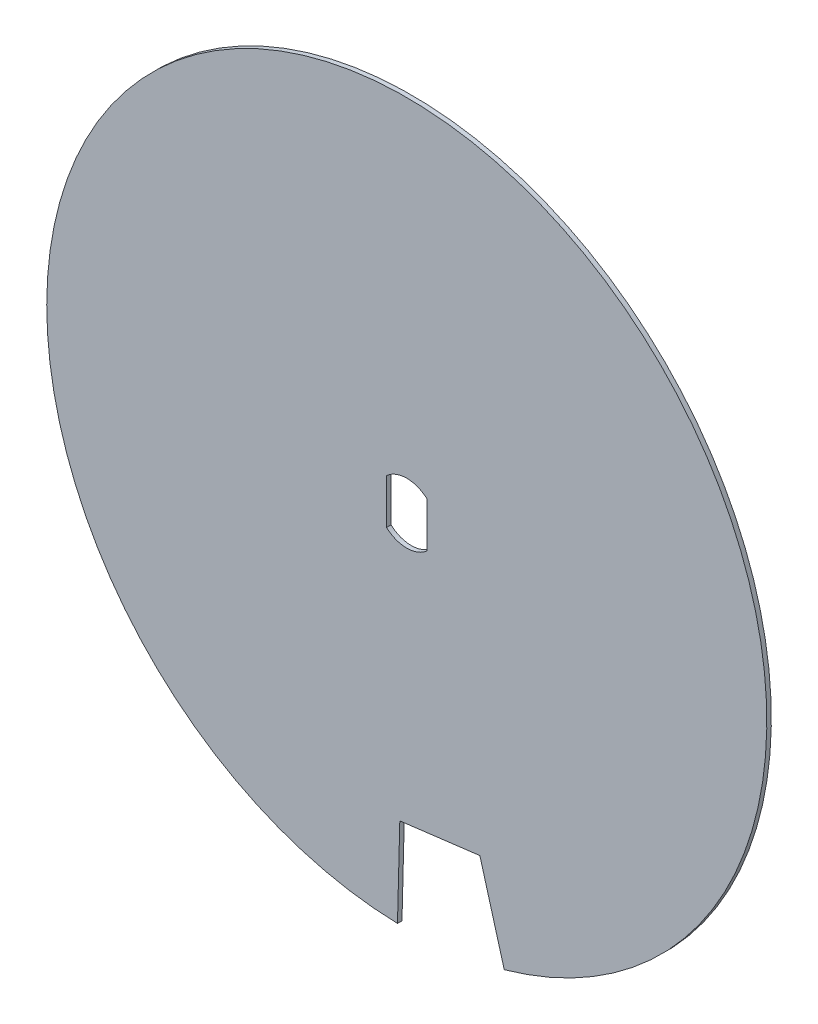
ISO-10303-21;
HEADER;
FILE_DESCRIPTION(('STEP AP214'),'2;1');
FILE_NAME('part.step','',(''),(''),'','','');
FILE_SCHEMA(('AUTOMOTIVE_DESIGN { 1 0 10303 214 1 1 1 1 }'));
ENDSEC;
DATA;
#1=APPLICATION_CONTEXT('core data for automotive mechanical design processes');
#2=APPLICATION_PROTOCOL_DEFINITION('international standard','automotive_design',2000,#1);
#3=PRODUCT_CONTEXT('',#1,'mechanical');
#4=PRODUCT('Part','Part','',(#3));
#5=PRODUCT_RELATED_PRODUCT_CATEGORY('part','',(#4));
#6=PRODUCT_DEFINITION_FORMATION('','',#4);
#7=PRODUCT_DEFINITION_CONTEXT('part definition',#1,'design');
#8=PRODUCT_DEFINITION('design','',#6,#7);
#9=PRODUCT_DEFINITION_SHAPE('','',#8);
#10=(LENGTH_UNIT() NAMED_UNIT(*) SI_UNIT(.MILLI.,.METRE.));
#11=(NAMED_UNIT(*) PLANE_ANGLE_UNIT() SI_UNIT($,.RADIAN.));
#12=(NAMED_UNIT(*) SI_UNIT($,.STERADIAN.) SOLID_ANGLE_UNIT());
#13=UNCERTAINTY_MEASURE_WITH_UNIT(LENGTH_MEASURE(1.E-05),#10,'distance_accuracy_value','');
#14=(GEOMETRIC_REPRESENTATION_CONTEXT(3) GLOBAL_UNCERTAINTY_ASSIGNED_CONTEXT((#13)) GLOBAL_UNIT_ASSIGNED_CONTEXT((#10,
#11,#12)) REPRESENTATION_CONTEXT('',''));
#15=CARTESIAN_POINT('',(0.,0.,0.));
#16=DIRECTION('',(0.,0.,1.));
#17=DIRECTION('',(1.,0.,0.));
#18=AXIS2_PLACEMENT_3D('',#15,#16,#17);
#19=CARTESIAN_POINT('',(0.,0.,0.5));
#20=DIRECTION('',(0.,0.,-1.));
#21=DIRECTION('',(-1.,0.,0.));
#22=AXIS2_PLACEMENT_3D('',#19,#20,#21);
#23=CYLINDRICAL_SURFACE('',#22,40.);
#24=DIRECTION('',(0.,0.,1.));
#25=VECTOR('',#24,1.);
#26=CARTESIAN_POINT('',(10.8269372284409,-38.5068491342956,0.));
#27=LINE('',#26,#25);
#28=CARTESIAN_POINT('',(10.8269372284409,-38.5068491342956,0.));
#29=VERTEX_POINT('',#28);
#30=CARTESIAN_POINT('',(10.8269372284409,-38.5068491342956,0.5));
#31=VERTEX_POINT('',#30);
#32=EDGE_CURVE('E125',#29,#31,#27,.T.);
#33=ORIENTED_EDGE('',*,*,#32,.F.);
#34=CARTESIAN_POINT('',(0.,0.,0.));
#35=DIRECTION('',(0.,0.,1.));
#36=DIRECTION('',(1.,0.,0.));
#37=AXIS2_PLACEMENT_3D('',#34,#35,#36);
#38=CIRCLE('',#37,40.);
#39=CARTESIAN_POINT('',(-1.03399958351597,-39.9866333274169,0.));
#40=VERTEX_POINT('',#39);
#41=EDGE_CURVE('E36',#29,#40,#38,.T.);
#42=ORIENTED_EDGE('',*,*,#41,.T.);
#43=DIRECTION('',(0.,0.,1.));
#44=VECTOR('',#43,1.);
#45=CARTESIAN_POINT('',(-1.03399958351597,-39.9866333274169,0.));
#46=LINE('',#45,#44);
#47=CARTESIAN_POINT('',(-1.03399958351597,-39.9866333274169,0.5));
#48=VERTEX_POINT('',#47);
#49=EDGE_CURVE('E127',#40,#48,#46,.T.);
#50=ORIENTED_EDGE('',*,*,#49,.T.);
#51=CARTESIAN_POINT('',(0.,0.,0.5));
#52=DIRECTION('',(0.,0.,1.));
#53=DIRECTION('',(1.,0.,0.));
#54=AXIS2_PLACEMENT_3D('',#51,#52,#53);
#55=CIRCLE('',#54,40.);
#56=EDGE_CURVE('E11',#31,#48,#55,.T.);
#57=ORIENTED_EDGE('',*,*,#56,.F.);
#58=EDGE_LOOP('',(#33,#42,#50,#57));
#59=FACE_BOUND('',#58,.T.);
#60=ADVANCED_FACE('F33',(#59),#23,.T.);
#61=CARTESIAN_POINT('',(0.,0.,0.5));
#62=DIRECTION('',(0.,0.,1.));
#63=DIRECTION('',(1.,0.,0.));
#64=AXIS2_PLACEMENT_3D('',#61,#62,#63);
#65=PLANE('',#64);
#66=CARTESIAN_POINT('',(0.,0.,0.5));
#67=DIRECTION('',(0.,0.,1.));
#68=DIRECTION('',(1.,0.,0.));
#69=AXIS2_PLACEMENT_3D('',#66,#67,#68);
#70=CIRCLE('',#69,3.36340601176843);
#71=CARTESIAN_POINT('',(2.25,2.5,0.5));
#72=VERTEX_POINT('',#71);
#73=CARTESIAN_POINT('',(-2.25,2.5,0.5));
#74=VERTEX_POINT('',#73);
#75=EDGE_CURVE('E55',#72,#74,#70,.T.);
#76=ORIENTED_EDGE('',*,*,#75,.F.);
#77=DIRECTION('',(0.,-1.,0.));
#78=VECTOR('',#77,1.);
#79=CARTESIAN_POINT('',(2.25000000000001,-88.1414213562373,0.5));
#80=LINE('',#79,#78);
#81=CARTESIAN_POINT('',(2.25,-2.5,0.5));
#82=VERTEX_POINT('',#81);
#83=EDGE_CURVE('E135',#72,#82,#80,.T.);
#84=ORIENTED_EDGE('',*,*,#83,.T.);
#85=CARTESIAN_POINT('',(0.,0.,0.5));
#86=DIRECTION('',(0.,0.,1.));
#87=DIRECTION('',(1.,0.,0.));
#88=AXIS2_PLACEMENT_3D('',#85,#86,#87);
#89=CIRCLE('',#88,3.36340601176843);
#90=CARTESIAN_POINT('',(-2.25,-2.5,0.5));
#91=VERTEX_POINT('',#90);
#92=EDGE_CURVE('E148',#82,#91,#89,.F.);
#93=ORIENTED_EDGE('',*,*,#92,.T.);
#94=DIRECTION('',(0.,-1.,0.));
#95=VECTOR('',#94,1.);
#96=CARTESIAN_POINT('',(-2.25,-88.1414213562373,0.5));
#97=LINE('',#96,#95);
#98=EDGE_CURVE('E145',#74,#91,#97,.T.);
#99=ORIENTED_EDGE('',*,*,#98,.F.);
#100=EDGE_LOOP('',(#76,#84,#93,#99));
#101=FACE_BOUND('',#100,.T.);
#102=DIRECTION('',(0.992352599773581,0.123435479999131,0.));
#103=VECTOR('',#102,1.);
#104=CARTESIAN_POINT('',(-7.13528279382084,-30.7777166044294,0.5));
#105=LINE('',#104,#103);
#106=CARTESIAN_POINT('',(-0.77541327667455,-29.9866333274169,0.5));
#107=VERTEX_POINT('',#106);
#108=CARTESIAN_POINT('',(8.12020292133069,-28.8801368507217,0.5));
#109=VERTEX_POINT('',#108);
#110=EDGE_CURVE('E119',#107,#109,#105,.T.);
#111=ORIENTED_EDGE('',*,*,#110,.T.);
#112=DIRECTION('',(0.270673430711023,-0.962671228357389,0.));
#113=VECTOR('',#112,1.);
#114=CARTESIAN_POINT('',(22.9669682097954,-81.6838189108171,0.5));
#115=LINE('',#114,#113);
#116=EDGE_CURVE('E110',#109,#31,#115,.T.);
#117=ORIENTED_EDGE('',*,*,#116,.T.);
#118=ORIENTED_EDGE('',*,*,#56,.T.);
#119=DIRECTION('',(0.0258499895878992,0.999665833185423,0.));
#120=VECTOR('',#119,1.);
#121=CARTESIAN_POINT('',(-2.27769344033057,-88.0825233227521,0.5));
#122=LINE('',#121,#120);
#123=EDGE_CURVE('E116',#48,#107,#122,.T.);
#124=ORIENTED_EDGE('',*,*,#123,.T.);
#125=EDGE_LOOP('',(#111,#117,#118,#124));
#126=FACE_BOUND('',#125,.T.);
#127=ADVANCED_FACE('F165',(#101,#126),#65,.T.);
#128=CARTESIAN_POINT('',(0.,0.,0.));
#129=DIRECTION('',(0.,0.,1.));
#130=DIRECTION('',(1.,0.,0.));
#131=AXIS2_PLACEMENT_3D('',#128,#129,#130);
#132=PLANE('',#131);
#133=DIRECTION('',(0.,-1.,0.));
#134=VECTOR('',#133,1.);
#135=CARTESIAN_POINT('',(2.25000000000001,-88.1414213562373,0.));
#136=LINE('',#135,#134);
#137=CARTESIAN_POINT('',(2.25,2.5,0.));
#138=VERTEX_POINT('',#137);
#139=CARTESIAN_POINT('',(2.25,-2.5,0.));
#140=VERTEX_POINT('',#139);
#141=EDGE_CURVE('E141',#138,#140,#136,.T.);
#142=ORIENTED_EDGE('',*,*,#141,.F.);
#143=CARTESIAN_POINT('',(0.,0.,0.));
#144=DIRECTION('',(0.,0.,1.));
#145=DIRECTION('',(1.,0.,0.));
#146=AXIS2_PLACEMENT_3D('',#143,#144,#145);
#147=CIRCLE('',#146,3.36340601176843);
#148=CARTESIAN_POINT('',(-2.25,2.5,0.));
#149=VERTEX_POINT('',#148);
#150=EDGE_CURVE('E131',#138,#149,#147,.T.);
#151=ORIENTED_EDGE('',*,*,#150,.T.);
#152=DIRECTION('',(0.,-1.,0.));
#153=VECTOR('',#152,1.);
#154=CARTESIAN_POINT('',(-2.25,-88.1414213562373,0.));
#155=LINE('',#154,#153);
#156=CARTESIAN_POINT('',(-2.25,-2.5,0.));
#157=VERTEX_POINT('',#156);
#158=EDGE_CURVE('E134',#149,#157,#155,.T.);
#159=ORIENTED_EDGE('',*,*,#158,.T.);
#160=CARTESIAN_POINT('',(0.,0.,0.));
#161=DIRECTION('',(0.,0.,1.));
#162=DIRECTION('',(1.,0.,0.));
#163=AXIS2_PLACEMENT_3D('',#160,#161,#162);
#164=CIRCLE('',#163,3.36340601176843);
#165=EDGE_CURVE('E138',#140,#157,#164,.F.);
#166=ORIENTED_EDGE('',*,*,#165,.F.);
#167=EDGE_LOOP('',(#142,#151,#159,#166));
#168=FACE_BOUND('',#167,.T.);
#169=DIRECTION('',(0.270673430711023,-0.962671228357389,0.));
#170=VECTOR('',#169,1.);
#171=CARTESIAN_POINT('',(22.9669682097954,-81.6838189108171,0.));
#172=LINE('',#171,#170);
#173=CARTESIAN_POINT('',(8.12020292133069,-28.8801368507217,0.));
#174=VERTEX_POINT('',#173);
#175=EDGE_CURVE('E104',#174,#29,#172,.T.);
#176=ORIENTED_EDGE('',*,*,#175,.F.);
#177=DIRECTION('',(0.992352599773581,0.123435479999131,0.));
#178=VECTOR('',#177,1.);
#179=CARTESIAN_POINT('',(-7.13528279382084,-30.7777166044294,0.));
#180=LINE('',#179,#178);
#181=CARTESIAN_POINT('',(-0.77541327667455,-29.9866333274169,0.));
#182=VERTEX_POINT('',#181);
#183=EDGE_CURVE('E95',#182,#174,#180,.T.);
#184=ORIENTED_EDGE('',*,*,#183,.F.);
#185=DIRECTION('',(0.0258499895878992,0.999665833185423,0.));
#186=VECTOR('',#185,1.);
#187=CARTESIAN_POINT('',(-2.27769344033057,-88.0825233227521,0.));
#188=LINE('',#187,#186);
#189=EDGE_CURVE('E103',#40,#182,#188,.T.);
#190=ORIENTED_EDGE('',*,*,#189,.F.);
#191=ORIENTED_EDGE('',*,*,#41,.F.);
#192=EDGE_LOOP('',(#176,#184,#190,#191));
#193=FACE_BOUND('',#192,.T.);
#194=ADVANCED_FACE('F114',(#168,#193),#132,.F.);
#195=CARTESIAN_POINT('',(0.,0.,0.));
#196=DIRECTION('',(0.,0.,1.));
#197=DIRECTION('',(1.,0.,0.));
#198=AXIS2_PLACEMENT_3D('',#195,#196,#197);
#199=CYLINDRICAL_SURFACE('',#198,3.36340601176843);
#200=ORIENTED_EDGE('',*,*,#75,.T.);
#201=DIRECTION('',(0.,0.,1.));
#202=VECTOR('',#201,1.);
#203=CARTESIAN_POINT('',(-2.25,2.5,0.));
#204=LINE('',#203,#202);
#205=EDGE_CURVE('E143',#149,#74,#204,.T.);
#206=ORIENTED_EDGE('',*,*,#205,.F.);
#207=ORIENTED_EDGE('',*,*,#150,.F.);
#208=DIRECTION('',(0.,0.,1.));
#209=VECTOR('',#208,1.);
#210=CARTESIAN_POINT('',(2.25,2.5,0.));
#211=LINE('',#210,#209);
#212=EDGE_CURVE('E153',#138,#72,#211,.T.);
#213=ORIENTED_EDGE('',*,*,#212,.T.);
#214=EDGE_LOOP('',(#200,#206,#207,#213));
#215=FACE_BOUND('',#214,.T.);
#216=ADVANCED_FACE('F175',(#215),#199,.F.);
#217=CARTESIAN_POINT('',(2.25000000000001,-88.1414213562373,0.));
#218=DIRECTION('',(-1.,0.,0.));
#219=DIRECTION('',(0.,-1.,0.));
#220=AXIS2_PLACEMENT_3D('',#217,#218,#219);
#221=PLANE('',#220);
#222=ORIENTED_EDGE('',*,*,#83,.F.);
#223=ORIENTED_EDGE('',*,*,#212,.F.);
#224=ORIENTED_EDGE('',*,*,#141,.T.);
#225=DIRECTION('',(0.,0.,1.));
#226=VECTOR('',#225,1.);
#227=CARTESIAN_POINT('',(2.25,-2.5,0.));
#228=LINE('',#227,#226);
#229=EDGE_CURVE('E155',#140,#82,#228,.T.);
#230=ORIENTED_EDGE('',*,*,#229,.T.);
#231=EDGE_LOOP('',(#222,#223,#224,#230));
#232=FACE_BOUND('',#231,.T.);
#233=ADVANCED_FACE('F177',(#232),#221,.T.);
#234=CARTESIAN_POINT('',(0.,0.,0.));
#235=DIRECTION('',(0.,0.,1.));
#236=DIRECTION('',(1.,0.,0.));
#237=AXIS2_PLACEMENT_3D('',#234,#235,#236);
#238=CYLINDRICAL_SURFACE('',#237,3.36340601176843);
#239=ORIENTED_EDGE('',*,*,#92,.F.);
#240=ORIENTED_EDGE('',*,*,#229,.F.);
#241=ORIENTED_EDGE('',*,*,#165,.T.);
#242=DIRECTION('',(0.,0.,1.));
#243=VECTOR('',#242,1.);
#244=CARTESIAN_POINT('',(-2.25,-2.5,0.));
#245=LINE('',#244,#243);
#246=EDGE_CURVE('E157',#157,#91,#245,.T.);
#247=ORIENTED_EDGE('',*,*,#246,.T.);
#248=EDGE_LOOP('',(#239,#240,#241,#247));
#249=FACE_BOUND('',#248,.T.);
#250=ADVANCED_FACE('F171',(#249),#238,.F.);
#251=CARTESIAN_POINT('',(-2.25,-88.1414213562373,0.));
#252=DIRECTION('',(-1.,0.,0.));
#253=DIRECTION('',(0.,0.,1.));
#254=AXIS2_PLACEMENT_3D('',#251,#252,#253);
#255=PLANE('',#254);
#256=ORIENTED_EDGE('',*,*,#98,.T.);
#257=ORIENTED_EDGE('',*,*,#246,.F.);
#258=ORIENTED_EDGE('',*,*,#158,.F.);
#259=ORIENTED_EDGE('',*,*,#205,.T.);
#260=EDGE_LOOP('',(#256,#257,#258,#259));
#261=FACE_BOUND('',#260,.T.);
#262=ADVANCED_FACE('F162',(#261),#255,.F.);
#263=CARTESIAN_POINT('',(22.9669682097954,-81.6838189108171,0.));
#264=DIRECTION('',(-0.962671228357389,-0.270673430711023,0.));
#265=DIRECTION('',(0.270673430711023,-0.962671228357389,0.));
#266=AXIS2_PLACEMENT_3D('',#263,#264,#265);
#267=PLANE('',#266);
#268=ORIENTED_EDGE('',*,*,#116,.F.);
#269=DIRECTION('',(0.,0.,1.));
#270=VECTOR('',#269,1.);
#271=CARTESIAN_POINT('',(8.12020292133069,-28.8801368507217,0.));
#272=LINE('',#271,#270);
#273=EDGE_CURVE('E98',#174,#109,#272,.T.);
#274=ORIENTED_EDGE('',*,*,#273,.F.);
#275=ORIENTED_EDGE('',*,*,#175,.T.);
#276=ORIENTED_EDGE('',*,*,#32,.T.);
#277=EDGE_LOOP('',(#268,#274,#275,#276));
#278=FACE_BOUND('',#277,.T.);
#279=ADVANCED_FACE('F107',(#278),#267,.T.);
#280=CARTESIAN_POINT('',(-2.27769344033057,-88.0825233227521,0.));
#281=DIRECTION('',(0.999665833185423,-0.0258499895878992,0.));
#282=DIRECTION('',(0.0258499895878992,0.999665833185423,0.));
#283=AXIS2_PLACEMENT_3D('',#280,#281,#282);
#284=PLANE('',#283);
#285=ORIENTED_EDGE('',*,*,#123,.F.);
#286=ORIENTED_EDGE('',*,*,#49,.F.);
#287=ORIENTED_EDGE('',*,*,#189,.T.);
#288=DIRECTION('',(0.,0.,1.));
#289=VECTOR('',#288,1.);
#290=CARTESIAN_POINT('',(-0.77541327667455,-29.9866333274169,0.));
#291=LINE('',#290,#289);
#292=EDGE_CURVE('E47',#182,#107,#291,.T.);
#293=ORIENTED_EDGE('',*,*,#292,.T.);
#294=EDGE_LOOP('',(#285,#286,#287,#293));
#295=FACE_BOUND('',#294,.T.);
#296=ADVANCED_FACE('F195',(#295),#284,.T.);
#297=CARTESIAN_POINT('',(-7.13528279382084,-30.7777166044294,0.));
#298=DIRECTION('',(0.123435479999131,-0.992352599773581,0.));
#299=DIRECTION('',(0.992352599773581,0.123435479999131,0.));
#300=AXIS2_PLACEMENT_3D('',#297,#298,#299);
#301=PLANE('',#300);
#302=ORIENTED_EDGE('',*,*,#110,.F.);
#303=ORIENTED_EDGE('',*,*,#292,.F.);
#304=ORIENTED_EDGE('',*,*,#183,.T.);
#305=ORIENTED_EDGE('',*,*,#273,.T.);
#306=EDGE_LOOP('',(#302,#303,#304,#305));
#307=FACE_BOUND('',#306,.T.);
#308=ADVANCED_FACE('F97',(#307),#301,.T.);
#309=CLOSED_SHELL('',(#60,#127,#194,#216,#233,#250,#262,#279,#296,#308));
#310=MANIFOLD_SOLID_BREP('B2',#309);
#311=ADVANCED_BREP_SHAPE_REPRESENTATION('',(#18,#310),#14);
#312=SHAPE_DEFINITION_REPRESENTATION(#9,#311);
ENDSEC;
END-ISO-10303-21;
